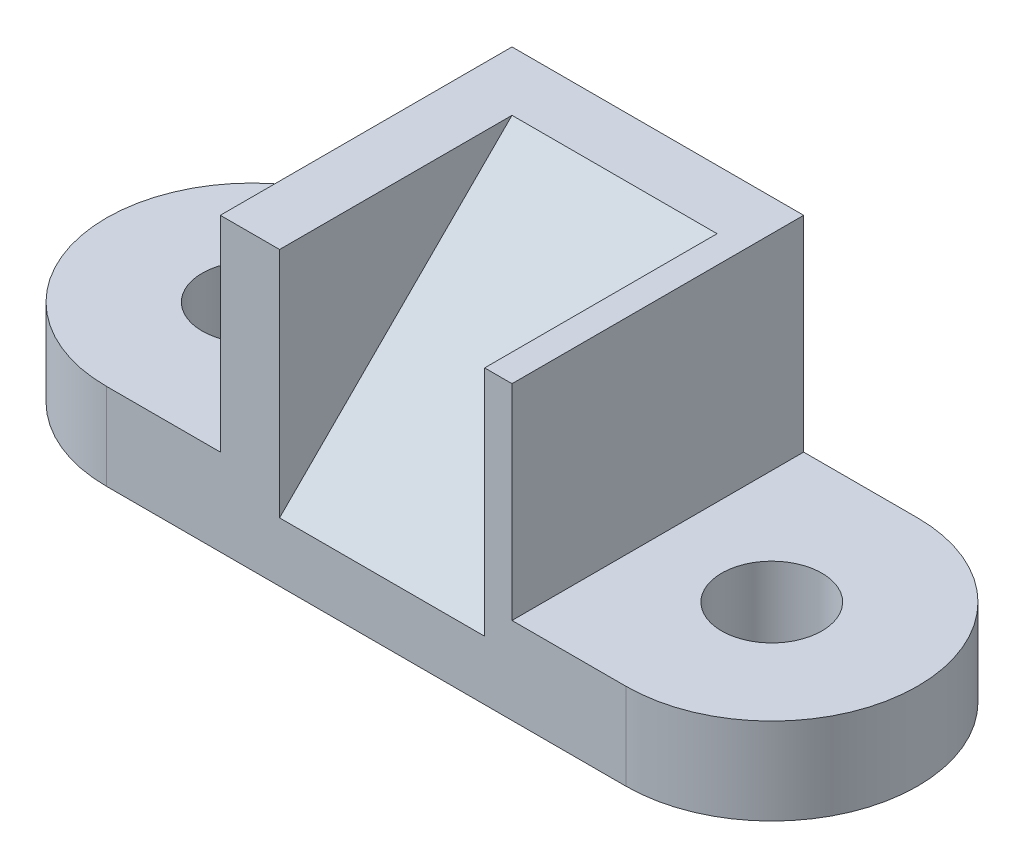
ISO-10303-21;
HEADER;
FILE_DESCRIPTION(('STEP AP214'),'2;1');
FILE_NAME('part.step','',(''),(''),'','','');
FILE_SCHEMA(('AUTOMOTIVE_DESIGN { 1 0 10303 214 1 1 1 1 }'));
ENDSEC;
DATA;
#1=APPLICATION_CONTEXT('core data for automotive mechanical design processes');
#2=APPLICATION_PROTOCOL_DEFINITION('international standard','automotive_design',2000,#1);
#3=PRODUCT_CONTEXT('',#1,'mechanical');
#4=PRODUCT('Part','Part','',(#3));
#5=PRODUCT_RELATED_PRODUCT_CATEGORY('part','',(#4));
#6=PRODUCT_DEFINITION_FORMATION('','',#4);
#7=PRODUCT_DEFINITION_CONTEXT('part definition',#1,'design');
#8=PRODUCT_DEFINITION('design','',#6,#7);
#9=PRODUCT_DEFINITION_SHAPE('','',#8);
#10=(LENGTH_UNIT() NAMED_UNIT(*) SI_UNIT(.MILLI.,.METRE.));
#11=(NAMED_UNIT(*) PLANE_ANGLE_UNIT() SI_UNIT($,.RADIAN.));
#12=(NAMED_UNIT(*) SI_UNIT($,.STERADIAN.) SOLID_ANGLE_UNIT());
#13=UNCERTAINTY_MEASURE_WITH_UNIT(LENGTH_MEASURE(1.E-05),#10,'distance_accuracy_value','');
#14=(GEOMETRIC_REPRESENTATION_CONTEXT(3) GLOBAL_UNCERTAINTY_ASSIGNED_CONTEXT((#13)) GLOBAL_UNIT_ASSIGNED_CONTEXT((#10,
#11,#12)) REPRESENTATION_CONTEXT('',''));
#15=CARTESIAN_POINT('',(0.,0.,0.));
#16=DIRECTION('',(0.,0.,1.));
#17=DIRECTION('',(1.,0.,0.));
#18=AXIS2_PLACEMENT_3D('',#15,#16,#17);
#19=CARTESIAN_POINT('',(0.,19.,32.));
#20=DIRECTION('',(0.,0.,-1.));
#21=DIRECTION('',(-1.,0.,0.));
#22=AXIS2_PLACEMENT_3D('',#19,#20,#21);
#23=PLANE('',#22);
#24=DIRECTION('',(0.,1.,0.));
#25=VECTOR('',#24,1.);
#26=CARTESIAN_POINT('',(83.,13.,32.));
#27=LINE('',#26,#25);
#28=CARTESIAN_POINT('',(83.,13.,32.));
#29=VERTEX_POINT('',#28);
#30=CARTESIAN_POINT('',(83.,64.,32.));
#31=VERTEX_POINT('',#30);
#32=EDGE_CURVE('E136',#29,#31,#27,.T.);
#33=ORIENTED_EDGE('',*,*,#32,.F.);
#34=DIRECTION('',(-1.,0.,0.));
#35=VECTOR('',#34,1.);
#36=CARTESIAN_POINT('',(83.,13.,32.));
#37=LINE('',#36,#35);
#38=CARTESIAN_POINT('',(38.,13.,32.));
#39=VERTEX_POINT('',#38);
#40=EDGE_CURVE('E123',#29,#39,#37,.T.);
#41=ORIENTED_EDGE('',*,*,#40,.T.);
#42=DIRECTION('',(0.,1.,0.));
#43=VECTOR('',#42,1.);
#44=CARTESIAN_POINT('',(38.,13.,32.));
#45=LINE('',#44,#43);
#46=CARTESIAN_POINT('',(38.,64.,32.));
#47=VERTEX_POINT('',#46);
#48=EDGE_CURVE('E147',#39,#47,#45,.T.);
#49=ORIENTED_EDGE('',*,*,#48,.T.);
#50=DIRECTION('',(1.,0.,0.));
#51=VECTOR('',#50,1.);
#52=CARTESIAN_POINT('',(25.,64.,32.));
#53=LINE('',#52,#51);
#54=CARTESIAN_POINT('',(25.,64.,32.));
#55=VERTEX_POINT('',#54);
#56=EDGE_CURVE('E157',#55,#47,#53,.T.);
#57=ORIENTED_EDGE('',*,*,#56,.F.);
#58=DIRECTION('',(0.,-1.,0.));
#59=VECTOR('',#58,1.);
#60=CARTESIAN_POINT('',(25.,64.,32.));
#61=LINE('',#60,#59);
#62=CARTESIAN_POINT('',(25.,19.,32.));
#63=VERTEX_POINT('',#62);
#64=EDGE_CURVE('E173',#55,#63,#61,.T.);
#65=ORIENTED_EDGE('',*,*,#64,.T.);
#66=DIRECTION('',(1.,0.,0.));
#67=VECTOR('',#66,1.);
#68=CARTESIAN_POINT('',(0.,19.,32.));
#69=LINE('',#68,#67);
#70=CARTESIAN_POINT('',(0.,19.,32.));
#71=VERTEX_POINT('',#70);
#72=EDGE_CURVE('E193',#71,#63,#69,.T.);
#73=ORIENTED_EDGE('',*,*,#72,.F.);
#74=DIRECTION('',(0.,-1.,0.));
#75=VECTOR('',#74,1.);
#76=CARTESIAN_POINT('',(0.,19.,32.));
#77=LINE('',#76,#75);
#78=CARTESIAN_POINT('',(0.,0.,32.));
#79=VERTEX_POINT('',#78);
#80=EDGE_CURVE('E11',#71,#79,#77,.T.);
#81=ORIENTED_EDGE('',*,*,#80,.T.);
#82=DIRECTION('',(1.,0.,0.));
#83=VECTOR('',#82,1.);
#84=CARTESIAN_POINT('',(0.,0.,32.));
#85=LINE('',#84,#83);
#86=CARTESIAN_POINT('',(114.,0.,32.));
#87=VERTEX_POINT('',#86);
#88=EDGE_CURVE('E205',#79,#87,#85,.T.);
#89=ORIENTED_EDGE('',*,*,#88,.T.);
#90=DIRECTION('',(0.,-1.,0.));
#91=VECTOR('',#90,1.);
#92=CARTESIAN_POINT('',(114.,19.,32.));
#93=LINE('',#92,#91);
#94=CARTESIAN_POINT('',(114.,19.,32.));
#95=VERTEX_POINT('',#94);
#96=EDGE_CURVE('E47',#95,#87,#93,.T.);
#97=ORIENTED_EDGE('',*,*,#96,.F.);
#98=CARTESIAN_POINT('',(89.,19.,32.));
#99=VERTEX_POINT('',#98);
#100=EDGE_CURVE('E191',#99,#95,#69,.T.);
#101=ORIENTED_EDGE('',*,*,#100,.F.);
#102=DIRECTION('',(0.,-1.,0.));
#103=VECTOR('',#102,1.);
#104=CARTESIAN_POINT('',(89.,64.,32.));
#105=LINE('',#104,#103);
#106=CARTESIAN_POINT('',(89.,64.,32.));
#107=VERTEX_POINT('',#106);
#108=EDGE_CURVE('E62',#107,#99,#105,.T.);
#109=ORIENTED_EDGE('',*,*,#108,.F.);
#110=EDGE_CURVE('E142',#31,#107,#53,.T.);
#111=ORIENTED_EDGE('',*,*,#110,.F.);
#112=EDGE_LOOP('',(#33,#41,#49,#57,#65,#73,#81,#89,#97,#101,#109,#111));
#113=FACE_BOUND('',#112,.T.);
#114=ADVANCED_FACE('F39',(#113),#23,.F.);
#115=CARTESIAN_POINT('',(0.,64.,0.));
#116=DIRECTION('',(0.,1.,0.));
#117=DIRECTION('',(0.,0.,1.));
#118=AXIS2_PLACEMENT_3D('',#115,#116,#117);
#119=PLANE('',#118);
#120=DIRECTION('',(-1.,0.,0.));
#121=VECTOR('',#120,1.);
#122=CARTESIAN_POINT('',(83.,64.,-19.));
#123=LINE('',#122,#121);
#124=CARTESIAN_POINT('',(83.,64.,-19.));
#125=VERTEX_POINT('',#124);
#126=CARTESIAN_POINT('',(38.,64.,-19.));
#127=VERTEX_POINT('',#126);
#128=EDGE_CURVE('E131',#125,#127,#123,.T.);
#129=ORIENTED_EDGE('',*,*,#128,.F.);
#130=DIRECTION('',(0.,0.,-1.));
#131=VECTOR('',#130,1.);
#132=CARTESIAN_POINT('',(83.,64.,32.));
#133=LINE('',#132,#131);
#134=EDGE_CURVE('E132',#31,#125,#133,.T.);
#135=ORIENTED_EDGE('',*,*,#134,.F.);
#136=ORIENTED_EDGE('',*,*,#110,.T.);
#137=DIRECTION('',(0.,0.,1.));
#138=VECTOR('',#137,1.);
#139=CARTESIAN_POINT('',(89.,64.,-32.));
#140=LINE('',#139,#138);
#141=CARTESIAN_POINT('',(89.,64.,-32.));
#142=VERTEX_POINT('',#141);
#143=EDGE_CURVE('E160',#142,#107,#140,.T.);
#144=ORIENTED_EDGE('',*,*,#143,.F.);
#145=DIRECTION('',(1.,0.,0.));
#146=VECTOR('',#145,1.);
#147=CARTESIAN_POINT('',(25.,64.,-32.));
#148=LINE('',#147,#146);
#149=CARTESIAN_POINT('',(25.,64.,-32.));
#150=VERTEX_POINT('',#149);
#151=EDGE_CURVE('E162',#150,#142,#148,.T.);
#152=ORIENTED_EDGE('',*,*,#151,.F.);
#153=DIRECTION('',(0.,0.,1.));
#154=VECTOR('',#153,1.);
#155=CARTESIAN_POINT('',(25.,64.,-32.));
#156=LINE('',#155,#154);
#157=EDGE_CURVE('E153',#150,#55,#156,.T.);
#158=ORIENTED_EDGE('',*,*,#157,.T.);
#159=ORIENTED_EDGE('',*,*,#56,.T.);
#160=DIRECTION('',(0.,0.,-1.));
#161=VECTOR('',#160,1.);
#162=CARTESIAN_POINT('',(38.,64.,32.));
#163=LINE('',#162,#161);
#164=EDGE_CURVE('E139',#47,#127,#163,.T.);
#165=ORIENTED_EDGE('',*,*,#164,.T.);
#166=EDGE_LOOP('',(#129,#135,#136,#144,#152,#158,#159,#165));
#167=FACE_BOUND('',#166,.T.);
#168=ADVANCED_FACE('F246',(#167),#119,.T.);
#169=CARTESIAN_POINT('',(0.,19.,0.));
#170=DIRECTION('',(0.,1.,0.));
#171=DIRECTION('',(0.,0.,1.));
#172=AXIS2_PLACEMENT_3D('',#169,#170,#171);
#173=PLANE('',#172);
#174=CARTESIAN_POINT('',(114.,19.,0.));
#175=DIRECTION('',(0.,1.,0.));
#176=DIRECTION('',(0.,0.,1.));
#177=AXIS2_PLACEMENT_3D('',#174,#175,#176);
#178=CIRCLE('',#177,11.);
#179=CARTESIAN_POINT('',(114.,19.,11.));
#180=VERTEX_POINT('',#179);
#181=EDGE_CURVE('E176',#180,#180,#178,.T.);
#182=ORIENTED_EDGE('',*,*,#181,.F.);
#183=EDGE_LOOP('',(#182));
#184=FACE_BOUND('',#183,.T.);
#185=DIRECTION('',(-1.,0.,0.));
#186=VECTOR('',#185,1.);
#187=CARTESIAN_POINT('',(0.,19.,-32.));
#188=LINE('',#187,#186);
#189=CARTESIAN_POINT('',(114.,19.,-32.));
#190=VERTEX_POINT('',#189);
#191=CARTESIAN_POINT('',(89.,19.,-32.));
#192=VERTEX_POINT('',#191);
#193=EDGE_CURVE('E199',#190,#192,#188,.T.);
#194=ORIENTED_EDGE('',*,*,#193,.T.);
#195=DIRECTION('',(0.,0.,1.));
#196=VECTOR('',#195,1.);
#197=CARTESIAN_POINT('',(89.,19.,-32.));
#198=LINE('',#197,#196);
#199=EDGE_CURVE('E156',#192,#99,#198,.T.);
#200=ORIENTED_EDGE('',*,*,#199,.T.);
#201=ORIENTED_EDGE('',*,*,#100,.T.);
#202=CARTESIAN_POINT('',(114.,19.,0.));
#203=DIRECTION('',(0.,1.,0.));
#204=DIRECTION('',(0.,0.,1.));
#205=AXIS2_PLACEMENT_3D('',#202,#203,#204);
#206=CIRCLE('',#205,32.);
#207=EDGE_CURVE('E196',#95,#190,#206,.T.);
#208=ORIENTED_EDGE('',*,*,#207,.T.);
#209=EDGE_LOOP('',(#194,#200,#201,#208));
#210=FACE_BOUND('',#209,.T.);
#211=ADVANCED_FACE('F249',(#184,#210),#173,.T.);
#212=DIRECTION('',(0.,0.,1.));
#213=VECTOR('',#212,1.);
#214=CARTESIAN_POINT('',(25.,19.,-32.));
#215=LINE('',#214,#213);
#216=CARTESIAN_POINT('',(25.,19.,-32.));
#217=VERTEX_POINT('',#216);
#218=EDGE_CURVE('E151',#217,#63,#215,.T.);
#219=ORIENTED_EDGE('',*,*,#218,.F.);
#220=CARTESIAN_POINT('',(0.,19.,-32.));
#221=VERTEX_POINT('',#220);
#222=EDGE_CURVE('E198',#217,#221,#188,.T.);
#223=ORIENTED_EDGE('',*,*,#222,.T.);
#224=CARTESIAN_POINT('',(0.,19.,0.));
#225=DIRECTION('',(0.,1.,0.));
#226=DIRECTION('',(0.,0.,1.));
#227=AXIS2_PLACEMENT_3D('',#224,#225,#226);
#228=CIRCLE('',#227,32.);
#229=EDGE_CURVE('E188',#221,#71,#228,.T.);
#230=ORIENTED_EDGE('',*,*,#229,.T.);
#231=ORIENTED_EDGE('',*,*,#72,.T.);
#232=EDGE_LOOP('',(#219,#223,#230,#231));
#233=FACE_BOUND('',#232,.T.);
#234=CARTESIAN_POINT('',(0.,19.,0.));
#235=DIRECTION('',(0.,1.,0.));
#236=DIRECTION('',(0.,0.,1.));
#237=AXIS2_PLACEMENT_3D('',#234,#235,#236);
#238=CIRCLE('',#237,11.);
#239=CARTESIAN_POINT('',(0.,19.,11.));
#240=VERTEX_POINT('',#239);
#241=EDGE_CURVE('E182',#240,#240,#238,.T.);
#242=ORIENTED_EDGE('',*,*,#241,.F.);
#243=EDGE_LOOP('',(#242));
#244=FACE_BOUND('',#243,.T.);
#245=ADVANCED_FACE('F237',(#233,#244),#173,.T.);
#246=CARTESIAN_POINT('',(0.,0.,0.));
#247=DIRECTION('',(0.,1.,0.));
#248=DIRECTION('',(0.,0.,1.));
#249=AXIS2_PLACEMENT_3D('',#246,#247,#248);
#250=PLANE('',#249);
#251=CARTESIAN_POINT('',(0.,0.,0.));
#252=DIRECTION('',(0.,1.,0.));
#253=DIRECTION('',(0.,0.,1.));
#254=AXIS2_PLACEMENT_3D('',#251,#252,#253);
#255=CIRCLE('',#254,32.);
#256=CARTESIAN_POINT('',(0.,0.,-32.));
#257=VERTEX_POINT('',#256);
#258=EDGE_CURVE('E185',#257,#79,#255,.T.);
#259=ORIENTED_EDGE('',*,*,#258,.F.);
#260=DIRECTION('',(-1.,0.,0.));
#261=VECTOR('',#260,1.);
#262=CARTESIAN_POINT('',(0.,0.,-32.));
#263=LINE('',#262,#261);
#264=CARTESIAN_POINT('',(114.,0.,-32.));
#265=VERTEX_POINT('',#264);
#266=EDGE_CURVE('E192',#265,#257,#263,.T.);
#267=ORIENTED_EDGE('',*,*,#266,.F.);
#268=CARTESIAN_POINT('',(114.,0.,0.));
#269=DIRECTION('',(0.,1.,0.));
#270=DIRECTION('',(0.,0.,1.));
#271=AXIS2_PLACEMENT_3D('',#268,#269,#270);
#272=CIRCLE('',#271,32.);
#273=EDGE_CURVE('E207',#87,#265,#272,.T.);
#274=ORIENTED_EDGE('',*,*,#273,.F.);
#275=ORIENTED_EDGE('',*,*,#88,.F.);
#276=EDGE_LOOP('',(#259,#267,#274,#275));
#277=FACE_BOUND('',#276,.T.);
#278=CARTESIAN_POINT('',(0.,0.,0.));
#279=DIRECTION('',(0.,1.,0.));
#280=DIRECTION('',(0.,0.,1.));
#281=AXIS2_PLACEMENT_3D('',#278,#279,#280);
#282=CIRCLE('',#281,11.);
#283=CARTESIAN_POINT('',(0.,0.,11.));
#284=VERTEX_POINT('',#283);
#285=EDGE_CURVE('E179',#284,#284,#282,.T.);
#286=ORIENTED_EDGE('',*,*,#285,.T.);
#287=EDGE_LOOP('',(#286));
#288=FACE_BOUND('',#287,.T.);
#289=CARTESIAN_POINT('',(114.,0.,0.));
#290=DIRECTION('',(0.,1.,0.));
#291=DIRECTION('',(0.,0.,1.));
#292=AXIS2_PLACEMENT_3D('',#289,#290,#291);
#293=CIRCLE('',#292,11.);
#294=CARTESIAN_POINT('',(114.,0.,11.));
#295=VERTEX_POINT('',#294);
#296=EDGE_CURVE('E175',#295,#295,#293,.T.);
#297=ORIENTED_EDGE('',*,*,#296,.T.);
#298=EDGE_LOOP('',(#297));
#299=FACE_BOUND('',#298,.T.);
#300=ADVANCED_FACE('F225',(#277,#288,#299),#250,.F.);
#301=CARTESIAN_POINT('',(0.,19.,0.));
#302=DIRECTION('',(0.,-1.,0.));
#303=DIRECTION('',(0.,0.,-1.));
#304=AXIS2_PLACEMENT_3D('',#301,#302,#303);
#305=CYLINDRICAL_SURFACE('',#304,32.);
#306=ORIENTED_EDGE('',*,*,#258,.T.);
#307=ORIENTED_EDGE('',*,*,#80,.F.);
#308=ORIENTED_EDGE('',*,*,#229,.F.);
#309=DIRECTION('',(0.,-1.,0.));
#310=VECTOR('',#309,1.);
#311=CARTESIAN_POINT('',(0.,19.,-32.));
#312=LINE('',#311,#310);
#313=EDGE_CURVE('E202',#221,#257,#312,.T.);
#314=ORIENTED_EDGE('',*,*,#313,.T.);
#315=EDGE_LOOP('',(#306,#307,#308,#314));
#316=FACE_BOUND('',#315,.T.);
#317=ADVANCED_FACE('F41',(#316),#305,.T.);
#318=CARTESIAN_POINT('',(114.,19.,0.));
#319=DIRECTION('',(0.,-1.,0.));
#320=DIRECTION('',(0.,0.,-1.));
#321=AXIS2_PLACEMENT_3D('',#318,#319,#320);
#322=CYLINDRICAL_SURFACE('',#321,32.);
#323=ORIENTED_EDGE('',*,*,#273,.T.);
#324=DIRECTION('',(0.,-1.,0.));
#325=VECTOR('',#324,1.);
#326=CARTESIAN_POINT('',(114.,19.,-32.));
#327=LINE('',#326,#325);
#328=EDGE_CURVE('E212',#190,#265,#327,.T.);
#329=ORIENTED_EDGE('',*,*,#328,.F.);
#330=ORIENTED_EDGE('',*,*,#207,.F.);
#331=ORIENTED_EDGE('',*,*,#96,.T.);
#332=EDGE_LOOP('',(#323,#329,#330,#331));
#333=FACE_BOUND('',#332,.T.);
#334=ADVANCED_FACE('F219',(#333),#322,.T.);
#335=CARTESIAN_POINT('',(0.,19.,-32.));
#336=DIRECTION('',(0.,0.,1.));
#337=DIRECTION('',(1.,0.,0.));
#338=AXIS2_PLACEMENT_3D('',#335,#336,#337);
#339=PLANE('',#338);
#340=ORIENTED_EDGE('',*,*,#266,.T.);
#341=ORIENTED_EDGE('',*,*,#313,.F.);
#342=ORIENTED_EDGE('',*,*,#222,.F.);
#343=DIRECTION('',(0.,-1.,0.));
#344=VECTOR('',#343,1.);
#345=CARTESIAN_POINT('',(25.,64.,-32.));
#346=LINE('',#345,#344);
#347=EDGE_CURVE('E165',#150,#217,#346,.T.);
#348=ORIENTED_EDGE('',*,*,#347,.F.);
#349=ORIENTED_EDGE('',*,*,#151,.T.);
#350=DIRECTION('',(0.,-1.,0.));
#351=VECTOR('',#350,1.);
#352=CARTESIAN_POINT('',(89.,64.,-32.));
#353=LINE('',#352,#351);
#354=EDGE_CURVE('E170',#142,#192,#353,.T.);
#355=ORIENTED_EDGE('',*,*,#354,.T.);
#356=ORIENTED_EDGE('',*,*,#193,.F.);
#357=ORIENTED_EDGE('',*,*,#328,.T.);
#358=EDGE_LOOP('',(#340,#341,#342,#348,#349,#355,#356,#357));
#359=FACE_BOUND('',#358,.T.);
#360=ADVANCED_FACE('F229',(#359),#339,.F.);
#361=CARTESIAN_POINT('',(0.,19.,0.));
#362=DIRECTION('',(0.,-1.,0.));
#363=DIRECTION('',(0.,0.,-1.));
#364=AXIS2_PLACEMENT_3D('',#361,#362,#363);
#365=CYLINDRICAL_SURFACE('',#364,11.);
#366=ORIENTED_EDGE('',*,*,#241,.T.);
#367=EDGE_LOOP('',(#366));
#368=FACE_BOUND('',#367,.T.);
#369=ORIENTED_EDGE('',*,*,#285,.F.);
#370=EDGE_LOOP('',(#369));
#371=FACE_BOUND('',#370,.T.);
#372=ADVANCED_FACE('F270',(#368,#371),#365,.F.);
#373=CARTESIAN_POINT('',(114.,19.,0.));
#374=DIRECTION('',(0.,-1.,0.));
#375=DIRECTION('',(0.,0.,-1.));
#376=AXIS2_PLACEMENT_3D('',#373,#374,#375);
#377=CYLINDRICAL_SURFACE('',#376,11.);
#378=ORIENTED_EDGE('',*,*,#181,.T.);
#379=EDGE_LOOP('',(#378));
#380=FACE_BOUND('',#379,.T.);
#381=ORIENTED_EDGE('',*,*,#296,.F.);
#382=EDGE_LOOP('',(#381));
#383=FACE_BOUND('',#382,.T.);
#384=ADVANCED_FACE('F289',(#380,#383),#377,.F.);
#385=CARTESIAN_POINT('',(25.,64.,-32.));
#386=DIRECTION('',(1.,0.,0.));
#387=DIRECTION('',(0.,0.,-1.));
#388=AXIS2_PLACEMENT_3D('',#385,#386,#387);
#389=PLANE('',#388);
#390=ORIENTED_EDGE('',*,*,#218,.T.);
#391=ORIENTED_EDGE('',*,*,#64,.F.);
#392=ORIENTED_EDGE('',*,*,#157,.F.);
#393=ORIENTED_EDGE('',*,*,#347,.T.);
#394=EDGE_LOOP('',(#390,#391,#392,#393));
#395=FACE_BOUND('',#394,.T.);
#396=ADVANCED_FACE('F243',(#395),#389,.F.);
#397=CARTESIAN_POINT('',(89.,64.,-32.));
#398=DIRECTION('',(1.,0.,0.));
#399=DIRECTION('',(0.,0.,-1.));
#400=AXIS2_PLACEMENT_3D('',#397,#398,#399);
#401=PLANE('',#400);
#402=ORIENTED_EDGE('',*,*,#199,.F.);
#403=ORIENTED_EDGE('',*,*,#354,.F.);
#404=ORIENTED_EDGE('',*,*,#143,.T.);
#405=ORIENTED_EDGE('',*,*,#108,.T.);
#406=EDGE_LOOP('',(#402,#403,#404,#405));
#407=FACE_BOUND('',#406,.T.);
#408=ADVANCED_FACE('F247',(#407),#401,.T.);
#409=CARTESIAN_POINT('',(83.,64.,-19.));
#410=DIRECTION('',(0.,-0.707106781186548,-0.707106781186547));
#411=DIRECTION('',(0.,0.707106781186547,-0.707106781186548));
#412=AXIS2_PLACEMENT_3D('',#409,#410,#411);
#413=PLANE('',#412);
#414=DIRECTION('',(0.,-0.707106781186547,0.707106781186548));
#415=VECTOR('',#414,1.);
#416=CARTESIAN_POINT('',(38.,64.,-19.));
#417=LINE('',#416,#415);
#418=EDGE_CURVE('E54',#127,#39,#417,.T.);
#419=ORIENTED_EDGE('',*,*,#418,.T.);
#420=ORIENTED_EDGE('',*,*,#40,.F.);
#421=DIRECTION('',(0.,-0.707106781186547,0.707106781186548));
#422=VECTOR('',#421,1.);
#423=CARTESIAN_POINT('',(83.,64.,-19.));
#424=LINE('',#423,#422);
#425=EDGE_CURVE('E126',#125,#29,#424,.T.);
#426=ORIENTED_EDGE('',*,*,#425,.F.);
#427=ORIENTED_EDGE('',*,*,#128,.T.);
#428=EDGE_LOOP('',(#419,#420,#426,#427));
#429=FACE_BOUND('',#428,.T.);
#430=ADVANCED_FACE('F125',(#429),#413,.F.);
#431=CARTESIAN_POINT('',(83.,0.,0.));
#432=DIRECTION('',(-1.,0.,0.));
#433=DIRECTION('',(0.,0.,1.));
#434=AXIS2_PLACEMENT_3D('',#431,#432,#433);
#435=PLANE('',#434);
#436=ORIENTED_EDGE('',*,*,#425,.T.);
#437=ORIENTED_EDGE('',*,*,#32,.T.);
#438=ORIENTED_EDGE('',*,*,#134,.T.);
#439=EDGE_LOOP('',(#436,#437,#438));
#440=FACE_BOUND('',#439,.T.);
#441=ADVANCED_FACE('F135',(#440),#435,.T.);
#442=CARTESIAN_POINT('',(38.,0.,0.));
#443=DIRECTION('',(-1.,0.,0.));
#444=DIRECTION('',(0.,0.,1.));
#445=AXIS2_PLACEMENT_3D('',#442,#443,#444);
#446=PLANE('',#445);
#447=ORIENTED_EDGE('',*,*,#418,.F.);
#448=ORIENTED_EDGE('',*,*,#164,.F.);
#449=ORIENTED_EDGE('',*,*,#48,.F.);
#450=EDGE_LOOP('',(#447,#448,#449));
#451=FACE_BOUND('',#450,.T.);
#452=ADVANCED_FACE('F354',(#451),#446,.F.);
#453=CLOSED_SHELL('',(#114,#168,#211,#245,#300,#317,#334,#360,#372,#384,#396,#408,#430,#441,#452));
#454=MANIFOLD_SOLID_BREP('B2',#453);
#455=ADVANCED_BREP_SHAPE_REPRESENTATION('',(#18,#454),#14);
#456=SHAPE_DEFINITION_REPRESENTATION(#9,#455);
ENDSEC;
END-ISO-10303-21;
